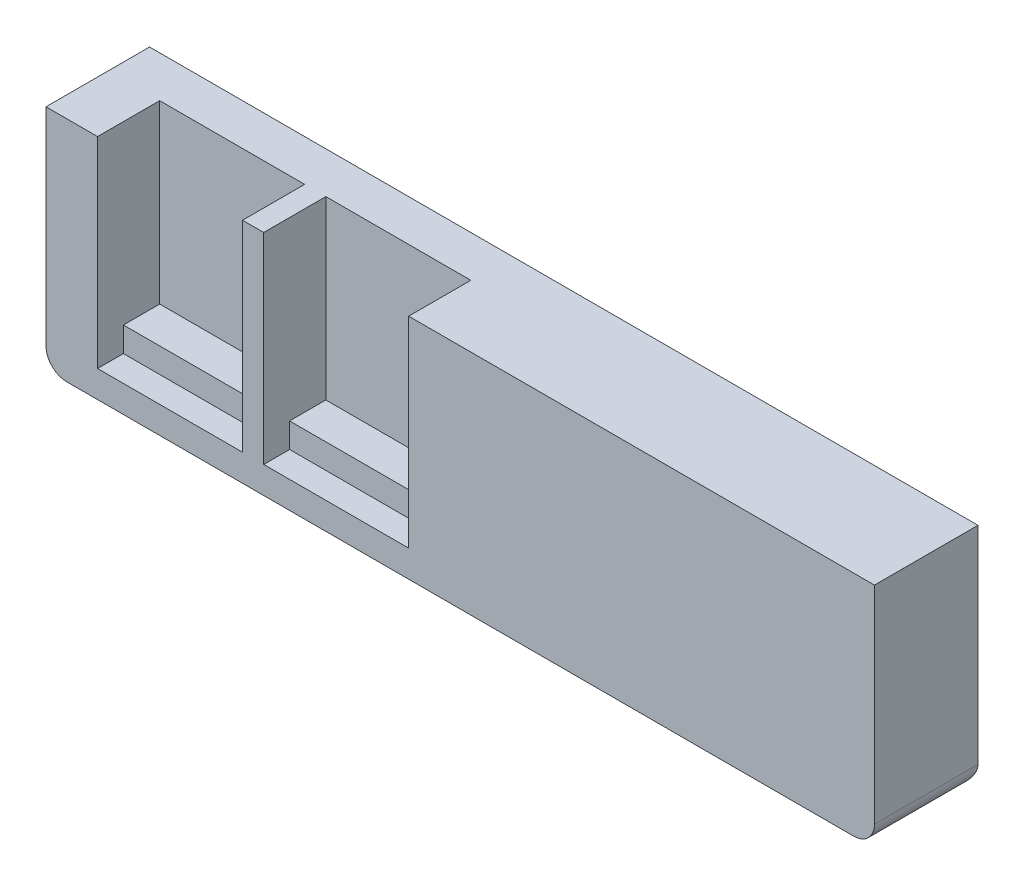
ISO-10303-21;
HEADER;
FILE_DESCRIPTION(('STEP AP214'),'2;1');
FILE_NAME('part.step','',(''),(''),'','','');
FILE_SCHEMA(('AUTOMOTIVE_DESIGN { 1 0 10303 214 1 1 1 1 }'));
ENDSEC;
DATA;
#1=APPLICATION_CONTEXT('core data for automotive mechanical design processes');
#2=APPLICATION_PROTOCOL_DEFINITION('international standard','automotive_design',2000,#1);
#3=PRODUCT_CONTEXT('',#1,'mechanical');
#4=PRODUCT('Part','Part','',(#3));
#5=PRODUCT_RELATED_PRODUCT_CATEGORY('part','',(#4));
#6=PRODUCT_DEFINITION_FORMATION('','',#4);
#7=PRODUCT_DEFINITION_CONTEXT('part definition',#1,'design');
#8=PRODUCT_DEFINITION('design','',#6,#7);
#9=PRODUCT_DEFINITION_SHAPE('','',#8);
#10=(LENGTH_UNIT() NAMED_UNIT(*) SI_UNIT(.MILLI.,.METRE.));
#11=(NAMED_UNIT(*) PLANE_ANGLE_UNIT() SI_UNIT($,.RADIAN.));
#12=(NAMED_UNIT(*) SI_UNIT($,.STERADIAN.) SOLID_ANGLE_UNIT());
#13=UNCERTAINTY_MEASURE_WITH_UNIT(LENGTH_MEASURE(1.E-05),#10,'distance_accuracy_value','');
#14=(GEOMETRIC_REPRESENTATION_CONTEXT(3) GLOBAL_UNCERTAINTY_ASSIGNED_CONTEXT((#13)) GLOBAL_UNIT_ASSIGNED_CONTEXT((#10,
#11,#12)) REPRESENTATION_CONTEXT('',''));
#15=CARTESIAN_POINT('',(0.,0.,0.));
#16=DIRECTION('',(0.,0.,1.));
#17=DIRECTION('',(1.,0.,0.));
#18=AXIS2_PLACEMENT_3D('',#15,#16,#17);
#19=CARTESIAN_POINT('',(0.,0.,-12.7));
#20=DIRECTION('',(0.,0.,1.));
#21=DIRECTION('',(1.,0.,0.));
#22=AXIS2_PLACEMENT_3D('',#19,#20,#21);
#23=PLANE('',#22);
#24=DIRECTION('',(-1.,0.,0.));
#25=VECTOR('',#24,1.);
#26=CARTESIAN_POINT('',(0.,3.302,-12.7));
#27=LINE('',#26,#25);
#28=CARTESIAN_POINT('',(24.1011996551631,3.302,-12.7));
#29=VERTEX_POINT('',#28);
#30=CARTESIAN_POINT('',(6.32119965516305,3.302,-12.7));
#31=VERTEX_POINT('',#30);
#32=EDGE_CURVE('E189',#29,#31,#27,.T.);
#33=ORIENTED_EDGE('',*,*,#32,.T.);
#34=DIRECTION('',(0.,1.,0.));
#35=VECTOR('',#34,1.);
#36=CARTESIAN_POINT('',(6.32119965516305,6.3388444270934,-12.7));
#37=LINE('',#36,#35);
#38=CARTESIAN_POINT('',(6.32119965516305,27.94,-12.7));
#39=VERTEX_POINT('',#38);
#40=EDGE_CURVE('E281',#31,#39,#37,.T.);
#41=ORIENTED_EDGE('',*,*,#40,.T.);
#42=DIRECTION('',(-1.,0.,0.));
#43=VECTOR('',#42,1.);
#44=CARTESIAN_POINT('',(0.,27.94,-12.7));
#45=LINE('',#44,#43);
#46=CARTESIAN_POINT('',(0.,27.94,-12.7));
#47=VERTEX_POINT('',#46);
#48=EDGE_CURVE('E43',#39,#47,#45,.T.);
#49=ORIENTED_EDGE('',*,*,#48,.T.);
#50=DIRECTION('',(0.,-1.,0.));
#51=VECTOR('',#50,1.);
#52=CARTESIAN_POINT('',(0.,50.8,-12.7));
#53=LINE('',#52,#51);
#54=CARTESIAN_POINT('',(0.,2.54,-12.7));
#55=VERTEX_POINT('',#54);
#56=EDGE_CURVE('E308',#47,#55,#53,.T.);
#57=ORIENTED_EDGE('',*,*,#56,.T.);
#58=CARTESIAN_POINT('',(2.54,2.54,-12.7));
#59=DIRECTION('',(0.,0.,1.));
#60=DIRECTION('',(1.,0.,0.));
#61=AXIS2_PLACEMENT_3D('',#58,#59,#60);
#62=CIRCLE('',#61,2.54);
#63=CARTESIAN_POINT('',(2.54,0.,-12.7));
#64=VERTEX_POINT('',#63);
#65=EDGE_CURVE('E211',#64,#55,#62,.F.);
#66=ORIENTED_EDGE('',*,*,#65,.F.);
#67=DIRECTION('',(-1.,0.,0.));
#68=VECTOR('',#67,1.);
#69=CARTESIAN_POINT('',(0.,0.,-12.7));
#70=LINE('',#69,#68);
#71=CARTESIAN_POINT('',(99.06,0.,-12.7));
#72=VERTEX_POINT('',#71);
#73=EDGE_CURVE('E311',#72,#64,#70,.T.);
#74=ORIENTED_EDGE('',*,*,#73,.F.);
#75=CARTESIAN_POINT('',(99.06,2.54,-12.7));
#76=DIRECTION('',(0.,0.,1.));
#77=DIRECTION('',(1.,0.,0.));
#78=AXIS2_PLACEMENT_3D('',#75,#76,#77);
#79=CIRCLE('',#78,2.54);
#80=CARTESIAN_POINT('',(101.6,2.54,-12.7));
#81=VERTEX_POINT('',#80);
#82=EDGE_CURVE('E318',#81,#72,#79,.F.);
#83=ORIENTED_EDGE('',*,*,#82,.F.);
#84=DIRECTION('',(0.,1.,0.));
#85=VECTOR('',#84,1.);
#86=CARTESIAN_POINT('',(101.6,50.8,-12.7));
#87=LINE('',#86,#85);
#88=CARTESIAN_POINT('',(101.6,27.94,-12.7));
#89=VERTEX_POINT('',#88);
#90=EDGE_CURVE('E303',#81,#89,#87,.T.);
#91=ORIENTED_EDGE('',*,*,#90,.T.);
#92=CARTESIAN_POINT('',(44.478800344837,27.94,-12.7));
#93=VERTEX_POINT('',#92);
#94=EDGE_CURVE('E200',#89,#93,#45,.T.);
#95=ORIENTED_EDGE('',*,*,#94,.T.);
#96=DIRECTION('',(0.,-1.,0.));
#97=VECTOR('',#96,1.);
#98=CARTESIAN_POINT('',(44.478800344837,6.3388444270934,-12.7));
#99=LINE('',#98,#97);
#100=CARTESIAN_POINT('',(44.4788003448369,3.302,-12.7));
#101=VERTEX_POINT('',#100);
#102=EDGE_CURVE('E290',#93,#101,#99,.T.);
#103=ORIENTED_EDGE('',*,*,#102,.T.);
#104=DIRECTION('',(1.,0.,0.));
#105=VECTOR('',#104,1.);
#106=CARTESIAN_POINT('',(0.,3.302,-12.7));
#107=LINE('',#106,#105);
#108=CARTESIAN_POINT('',(26.698800344837,3.302,-12.7));
#109=VERTEX_POINT('',#108);
#110=EDGE_CURVE('E314',#109,#101,#107,.T.);
#111=ORIENTED_EDGE('',*,*,#110,.F.);
#112=DIRECTION('',(0.,1.,0.));
#113=VECTOR('',#112,1.);
#114=CARTESIAN_POINT('',(26.698800344837,6.33884442709341,-12.7));
#115=LINE('',#114,#113);
#116=CARTESIAN_POINT('',(26.698800344837,27.94,-12.7));
#117=VERTEX_POINT('',#116);
#118=EDGE_CURVE('E294',#109,#117,#115,.T.);
#119=ORIENTED_EDGE('',*,*,#118,.T.);
#120=CARTESIAN_POINT('',(24.1011996551631,27.94,-12.7));
#121=VERTEX_POINT('',#120);
#122=EDGE_CURVE('E192',#117,#121,#45,.T.);
#123=ORIENTED_EDGE('',*,*,#122,.T.);
#124=DIRECTION('',(0.,-1.,0.));
#125=VECTOR('',#124,1.);
#126=CARTESIAN_POINT('',(24.1011996551631,6.33884442709341,-12.7));
#127=LINE('',#126,#125);
#128=EDGE_CURVE('E175',#121,#29,#127,.T.);
#129=ORIENTED_EDGE('',*,*,#128,.T.);
#130=EDGE_LOOP('',(#33,#41,#49,#57,#66,#74,#83,#91,#95,#103,#111,#119,#123,#129));
#131=FACE_BOUND('',#130,.T.);
#132=ADVANCED_FACE('F39',(#131),#23,.T.);
#133=CARTESIAN_POINT('',(0.,27.94,0.));
#134=DIRECTION('',(0.,1.,0.));
#135=DIRECTION('',(0.,0.,1.));
#136=AXIS2_PLACEMENT_3D('',#133,#134,#135);
#137=PLANE('',#136);
#138=DIRECTION('',(-1.,0.,0.));
#139=VECTOR('',#138,1.);
#140=CARTESIAN_POINT('',(0.,27.94,-25.4));
#141=LINE('',#140,#139);
#142=CARTESIAN_POINT('',(101.6,27.94,-25.4));
#143=VERTEX_POINT('',#142);
#144=CARTESIAN_POINT('',(0.,27.94,-25.4));
#145=VERTEX_POINT('',#144);
#146=EDGE_CURVE('E299',#143,#145,#141,.T.);
#147=ORIENTED_EDGE('',*,*,#146,.T.);
#148=DIRECTION('',(0.,0.,1.));
#149=VECTOR('',#148,1.);
#150=CARTESIAN_POINT('',(0.,27.94,0.));
#151=LINE('',#150,#149);
#152=EDGE_CURVE('E309',#145,#47,#151,.T.);
#153=ORIENTED_EDGE('',*,*,#152,.T.);
#154=ORIENTED_EDGE('',*,*,#48,.F.);
#155=DIRECTION('',(0.,0.,-1.));
#156=VECTOR('',#155,1.);
#157=CARTESIAN_POINT('',(6.32119965516305,27.94,-20.32));
#158=LINE('',#157,#156);
#159=CARTESIAN_POINT('',(6.32119965516305,27.94,-20.32));
#160=VERTEX_POINT('',#159);
#161=EDGE_CURVE('E282',#39,#160,#158,.T.);
#162=ORIENTED_EDGE('',*,*,#161,.T.);
#163=DIRECTION('',(-1.,0.,0.));
#164=VECTOR('',#163,1.);
#165=CARTESIAN_POINT('',(0.,27.94,-20.32));
#166=LINE('',#165,#164);
#167=CARTESIAN_POINT('',(24.1011996551631,27.94,-20.32));
#168=VERTEX_POINT('',#167);
#169=EDGE_CURVE('E312',#168,#160,#166,.T.);
#170=ORIENTED_EDGE('',*,*,#169,.F.);
#171=DIRECTION('',(0.,0.,1.));
#172=VECTOR('',#171,1.);
#173=CARTESIAN_POINT('',(24.1011996551631,27.94,-20.32));
#174=LINE('',#173,#172);
#175=EDGE_CURVE('E194',#168,#121,#174,.T.);
#176=ORIENTED_EDGE('',*,*,#175,.T.);
#177=ORIENTED_EDGE('',*,*,#122,.F.);
#178=DIRECTION('',(0.,0.,-1.));
#179=VECTOR('',#178,1.);
#180=CARTESIAN_POINT('',(26.698800344837,27.94,-20.32));
#181=LINE('',#180,#179);
#182=CARTESIAN_POINT('',(26.698800344837,27.94,-20.32));
#183=VERTEX_POINT('',#182);
#184=EDGE_CURVE('E295',#117,#183,#181,.T.);
#185=ORIENTED_EDGE('',*,*,#184,.T.);
#186=DIRECTION('',(1.,0.,0.));
#187=VECTOR('',#186,1.);
#188=CARTESIAN_POINT('',(0.,27.94,-20.32));
#189=LINE('',#188,#187);
#190=CARTESIAN_POINT('',(44.478800344837,27.94,-20.32));
#191=VERTEX_POINT('',#190);
#192=EDGE_CURVE('E286',#183,#191,#189,.T.);
#193=ORIENTED_EDGE('',*,*,#192,.T.);
#194=DIRECTION('',(0.,0.,1.));
#195=VECTOR('',#194,1.);
#196=CARTESIAN_POINT('',(44.478800344837,27.94,-20.32));
#197=LINE('',#196,#195);
#198=EDGE_CURVE('E291',#191,#93,#197,.T.);
#199=ORIENTED_EDGE('',*,*,#198,.T.);
#200=ORIENTED_EDGE('',*,*,#94,.F.);
#201=DIRECTION('',(0.,0.,-1.));
#202=VECTOR('',#201,1.);
#203=CARTESIAN_POINT('',(101.6,27.94,0.));
#204=LINE('',#203,#202);
#205=EDGE_CURVE('E304',#89,#143,#204,.T.);
#206=ORIENTED_EDGE('',*,*,#205,.T.);
#207=EDGE_LOOP('',(#147,#153,#154,#162,#170,#176,#177,#185,#193,#199,#200,#206));
#208=FACE_BOUND('',#207,.T.);
#209=ADVANCED_FACE('F342',(#208),#137,.T.);
#210=CARTESIAN_POINT('',(0.,2.54,-22.86));
#211=DIRECTION('',(1.,0.,0.));
#212=DIRECTION('',(0.,0.,-1.));
#213=AXIS2_PLACEMENT_3D('',#210,#211,#212);
#214=CYLINDRICAL_SURFACE('',#213,2.54);
#215=CARTESIAN_POINT('',(99.06,2.54,-22.86));
#216=DIRECTION('',(0.707106781186548,0.,0.707106781186547));
#217=DIRECTION('',(-0.707106781186547,0.,0.707106781186548));
#218=AXIS2_PLACEMENT_3D('',#215,#216,#217);
#219=ELLIPSE('',#218,3.59210244842766,2.54);
#220=CARTESIAN_POINT('',(101.6,2.54,-25.4));
#221=VERTEX_POINT('',#220);
#222=CARTESIAN_POINT('',(99.06,0.,-22.86));
#223=VERTEX_POINT('',#222);
#224=EDGE_CURVE('E50',#221,#223,#219,.F.);
#225=ORIENTED_EDGE('',*,*,#224,.T.);
#226=DIRECTION('',(-1.,0.,0.));
#227=VECTOR('',#226,1.);
#228=CARTESIAN_POINT('',(101.6,0.,-22.86));
#229=LINE('',#228,#227);
#230=CARTESIAN_POINT('',(2.54,0.,-22.86));
#231=VERTEX_POINT('',#230);
#232=EDGE_CURVE('E215',#231,#223,#229,.F.);
#233=ORIENTED_EDGE('',*,*,#232,.F.);
#234=CARTESIAN_POINT('',(2.54,2.54,-22.86));
#235=DIRECTION('',(0.707106781186547,0.,-0.707106781186547));
#236=DIRECTION('',(-0.707106781186547,0.,-0.707106781186547));
#237=AXIS2_PLACEMENT_3D('',#234,#235,#236);
#238=ELLIPSE('',#237,3.59210244842766,2.54);
#239=CARTESIAN_POINT('',(0.,2.54,-25.4));
#240=VERTEX_POINT('',#239);
#241=EDGE_CURVE('E11',#231,#240,#238,.T.);
#242=ORIENTED_EDGE('',*,*,#241,.T.);
#243=DIRECTION('',(-1.,0.,0.));
#244=VECTOR('',#243,1.);
#245=CARTESIAN_POINT('',(0.,2.54,-25.4));
#246=LINE('',#245,#244);
#247=EDGE_CURVE('E223',#221,#240,#246,.T.);
#248=ORIENTED_EDGE('',*,*,#247,.F.);
#249=EDGE_LOOP('',(#225,#233,#242,#248));
#250=FACE_BOUND('',#249,.T.);
#251=ADVANCED_FACE('F385',(#250),#214,.T.);
#252=CARTESIAN_POINT('',(0.,50.8,0.));
#253=DIRECTION('',(1.,0.,0.));
#254=DIRECTION('',(0.,0.,-1.));
#255=AXIS2_PLACEMENT_3D('',#252,#253,#254);
#256=PLANE('',#255);
#257=ORIENTED_EDGE('',*,*,#152,.F.);
#258=DIRECTION('',(0.,-1.,0.));
#259=VECTOR('',#258,1.);
#260=CARTESIAN_POINT('',(0.,50.8,-25.4));
#261=LINE('',#260,#259);
#262=EDGE_CURVE('E228',#145,#240,#261,.T.);
#263=ORIENTED_EDGE('',*,*,#262,.T.);
#264=DIRECTION('',(0.,0.,1.));
#265=VECTOR('',#264,1.);
#266=CARTESIAN_POINT('',(0.,2.54,0.));
#267=LINE('',#266,#265);
#268=EDGE_CURVE('E206',#240,#55,#267,.T.);
#269=ORIENTED_EDGE('',*,*,#268,.T.);
#270=ORIENTED_EDGE('',*,*,#56,.F.);
#271=EDGE_LOOP('',(#257,#263,#269,#270));
#272=FACE_BOUND('',#271,.T.);
#273=ADVANCED_FACE('F350',(#272),#256,.F.);
#274=CARTESIAN_POINT('',(0.,0.,0.));
#275=DIRECTION('',(0.,-1.,0.));
#276=DIRECTION('',(0.,0.,-1.));
#277=AXIS2_PLACEMENT_3D('',#274,#275,#276);
#278=PLANE('',#277);
#279=DIRECTION('',(0.,0.,-1.));
#280=VECTOR('',#279,1.);
#281=CARTESIAN_POINT('',(99.06,0.,0.));
#282=LINE('',#281,#280);
#283=EDGE_CURVE('E216',#223,#72,#282,.F.);
#284=ORIENTED_EDGE('',*,*,#283,.T.);
#285=ORIENTED_EDGE('',*,*,#73,.T.);
#286=DIRECTION('',(0.,0.,1.));
#287=VECTOR('',#286,1.);
#288=CARTESIAN_POINT('',(2.54,0.,-25.4));
#289=LINE('',#288,#287);
#290=EDGE_CURVE('E220',#64,#231,#289,.F.);
#291=ORIENTED_EDGE('',*,*,#290,.T.);
#292=ORIENTED_EDGE('',*,*,#232,.T.);
#293=EDGE_LOOP('',(#284,#285,#291,#292));
#294=FACE_BOUND('',#293,.T.);
#295=ADVANCED_FACE('F390',(#294),#278,.T.);
#296=CARTESIAN_POINT('',(2.54,2.54,0.));
#297=DIRECTION('',(0.,0.,-1.));
#298=DIRECTION('',(-1.,0.,0.));
#299=AXIS2_PLACEMENT_3D('',#296,#297,#298);
#300=CYLINDRICAL_SURFACE('',#299,2.54);
#301=ORIENTED_EDGE('',*,*,#290,.F.);
#302=ORIENTED_EDGE('',*,*,#65,.T.);
#303=ORIENTED_EDGE('',*,*,#268,.F.);
#304=ORIENTED_EDGE('',*,*,#241,.F.);
#305=EDGE_LOOP('',(#301,#302,#303,#304));
#306=FACE_BOUND('',#305,.T.);
#307=ADVANCED_FACE('F391',(#306),#300,.T.);
#308=CARTESIAN_POINT('',(101.6,50.8,0.));
#309=DIRECTION('',(-1.,0.,0.));
#310=DIRECTION('',(0.,0.,1.));
#311=AXIS2_PLACEMENT_3D('',#308,#309,#310);
#312=PLANE('',#311);
#313=ORIENTED_EDGE('',*,*,#205,.F.);
#314=ORIENTED_EDGE('',*,*,#90,.F.);
#315=DIRECTION('',(0.,0.,-1.));
#316=VECTOR('',#315,1.);
#317=CARTESIAN_POINT('',(101.6,2.54,-25.4));
#318=LINE('',#317,#316);
#319=EDGE_CURVE('E210',#81,#221,#318,.T.);
#320=ORIENTED_EDGE('',*,*,#319,.T.);
#321=DIRECTION('',(0.,-1.,0.));
#322=VECTOR('',#321,1.);
#323=CARTESIAN_POINT('',(101.6,50.8,-25.4));
#324=LINE('',#323,#322);
#325=EDGE_CURVE('E276',#143,#221,#324,.T.);
#326=ORIENTED_EDGE('',*,*,#325,.F.);
#327=EDGE_LOOP('',(#313,#314,#320,#326));
#328=FACE_BOUND('',#327,.T.);
#329=ADVANCED_FACE('F396',(#328),#312,.F.);
#330=CARTESIAN_POINT('',(99.06,2.54,0.));
#331=DIRECTION('',(0.,0.,1.));
#332=DIRECTION('',(1.,0.,0.));
#333=AXIS2_PLACEMENT_3D('',#330,#331,#332);
#334=CYLINDRICAL_SURFACE('',#333,2.54);
#335=ORIENTED_EDGE('',*,*,#319,.F.);
#336=ORIENTED_EDGE('',*,*,#82,.T.);
#337=ORIENTED_EDGE('',*,*,#283,.F.);
#338=ORIENTED_EDGE('',*,*,#224,.F.);
#339=EDGE_LOOP('',(#335,#336,#337,#338));
#340=FACE_BOUND('',#339,.T.);
#341=ADVANCED_FACE('F389',(#340),#334,.T.);
#342=CARTESIAN_POINT('',(0.,50.8,-25.4));
#343=DIRECTION('',(0.,0.,1.));
#344=DIRECTION('',(1.,0.,0.));
#345=AXIS2_PLACEMENT_3D('',#342,#343,#344);
#346=PLANE('',#345);
#347=ORIENTED_EDGE('',*,*,#146,.F.);
#348=ORIENTED_EDGE('',*,*,#325,.T.);
#349=ORIENTED_EDGE('',*,*,#247,.T.);
#350=ORIENTED_EDGE('',*,*,#262,.F.);
#351=EDGE_LOOP('',(#347,#348,#349,#350));
#352=FACE_BOUND('',#351,.T.);
#353=ADVANCED_FACE('F393',(#352),#346,.F.);
#354=CARTESIAN_POINT('',(26.698800344837,6.33884442709341,-20.32));
#355=DIRECTION('',(0.,-1.,0.));
#356=DIRECTION('',(1.,0.,0.));
#357=AXIS2_PLACEMENT_3D('',#354,#355,#356);
#358=PLANE('',#357);
#359=DIRECTION('',(0.,0.,1.));
#360=VECTOR('',#359,1.);
#361=CARTESIAN_POINT('',(26.698800344837,6.33884442709341,-20.32));
#362=LINE('',#361,#360);
#363=CARTESIAN_POINT('',(26.698800344837,6.33884442709341,-20.32));
#364=VERTEX_POINT('',#363);
#365=CARTESIAN_POINT('',(26.698800344837,6.33884442709341,-15.875));
#366=VERTEX_POINT('',#365);
#367=EDGE_CURVE('E237',#364,#366,#362,.T.);
#368=ORIENTED_EDGE('',*,*,#367,.T.);
#369=DIRECTION('',(1.,0.,0.));
#370=VECTOR('',#369,1.);
#371=CARTESIAN_POINT('',(26.698800344837,6.33884442709341,-15.875));
#372=LINE('',#371,#370);
#373=CARTESIAN_POINT('',(44.478800344837,6.3388444270934,-15.875));
#374=VERTEX_POINT('',#373);
#375=EDGE_CURVE('E369',#366,#374,#372,.T.);
#376=ORIENTED_EDGE('',*,*,#375,.T.);
#377=DIRECTION('',(0.,0.,1.));
#378=VECTOR('',#377,1.);
#379=CARTESIAN_POINT('',(44.478800344837,6.3388444270934,-20.32));
#380=LINE('',#379,#378);
#381=CARTESIAN_POINT('',(44.478800344837,6.3388444270934,-20.32));
#382=VERTEX_POINT('',#381);
#383=EDGE_CURVE('E233',#382,#374,#380,.T.);
#384=ORIENTED_EDGE('',*,*,#383,.F.);
#385=DIRECTION('',(1.,0.,0.));
#386=VECTOR('',#385,1.);
#387=CARTESIAN_POINT('',(26.698800344837,6.33884442709341,-20.32));
#388=LINE('',#387,#386);
#389=EDGE_CURVE('E265',#364,#382,#388,.T.);
#390=ORIENTED_EDGE('',*,*,#389,.F.);
#391=EDGE_LOOP('',(#368,#376,#384,#390));
#392=FACE_BOUND('',#391,.T.);
#393=ADVANCED_FACE('F414',(#392),#358,.F.);
#394=CARTESIAN_POINT('',(44.4788003448369,3.302,-15.875));
#395=DIRECTION('',(0.,0.,-1.));
#396=DIRECTION('',(-1.,0.,0.));
#397=AXIS2_PLACEMENT_3D('',#394,#395,#396);
#398=PLANE('',#397);
#399=DIRECTION('',(0.,1.,0.));
#400=VECTOR('',#399,1.);
#401=CARTESIAN_POINT('',(26.698800344837,3.302,-15.875));
#402=LINE('',#401,#400);
#403=CARTESIAN_POINT('',(26.698800344837,3.302,-15.875));
#404=VERTEX_POINT('',#403);
#405=EDGE_CURVE('E183',#404,#366,#402,.T.);
#406=ORIENTED_EDGE('',*,*,#405,.F.);
#407=DIRECTION('',(-1.,0.,0.));
#408=VECTOR('',#407,1.);
#409=CARTESIAN_POINT('',(44.4788003448369,3.302,-15.875));
#410=LINE('',#409,#408);
#411=CARTESIAN_POINT('',(44.4788003448369,3.302,-15.875));
#412=VERTEX_POINT('',#411);
#413=EDGE_CURVE('E249',#412,#404,#410,.T.);
#414=ORIENTED_EDGE('',*,*,#413,.F.);
#415=DIRECTION('',(0.,1.,0.));
#416=VECTOR('',#415,1.);
#417=CARTESIAN_POINT('',(44.4788003448369,3.302,-15.875));
#418=LINE('',#417,#416);
#419=EDGE_CURVE('E250',#412,#374,#418,.T.);
#420=ORIENTED_EDGE('',*,*,#419,.T.);
#421=ORIENTED_EDGE('',*,*,#375,.F.);
#422=EDGE_LOOP('',(#406,#414,#420,#421));
#423=FACE_BOUND('',#422,.T.);
#424=ADVANCED_FACE('F410',(#423),#398,.F.);
#425=CARTESIAN_POINT('',(44.478800344837,6.3388444270934,-20.32));
#426=DIRECTION('',(1.,0.,0.));
#427=DIRECTION('',(0.,1.,0.));
#428=AXIS2_PLACEMENT_3D('',#425,#426,#427);
#429=PLANE('',#428);
#430=ORIENTED_EDGE('',*,*,#198,.F.);
#431=DIRECTION('',(0.,1.,0.));
#432=VECTOR('',#431,1.);
#433=CARTESIAN_POINT('',(44.478800344837,6.3388444270934,-20.32));
#434=LINE('',#433,#432);
#435=EDGE_CURVE('E242',#382,#191,#434,.T.);
#436=ORIENTED_EDGE('',*,*,#435,.F.);
#437=ORIENTED_EDGE('',*,*,#383,.T.);
#438=ORIENTED_EDGE('',*,*,#419,.F.);
#439=DIRECTION('',(0.,0.,-1.));
#440=VECTOR('',#439,1.);
#441=CARTESIAN_POINT('',(44.4788003448369,3.302,-9.52500000000001));
#442=LINE('',#441,#440);
#443=EDGE_CURVE('E59',#101,#412,#442,.T.);
#444=ORIENTED_EDGE('',*,*,#443,.F.);
#445=ORIENTED_EDGE('',*,*,#102,.F.);
#446=EDGE_LOOP('',(#430,#436,#437,#438,#444,#445));
#447=FACE_BOUND('',#446,.T.);
#448=ADVANCED_FACE('F403',(#447),#429,.F.);
#449=CARTESIAN_POINT('',(26.698800344837,6.33884442709341,-20.32));
#450=DIRECTION('',(-1.,0.,0.));
#451=DIRECTION('',(0.,0.,1.));
#452=AXIS2_PLACEMENT_3D('',#449,#450,#451);
#453=PLANE('',#452);
#454=ORIENTED_EDGE('',*,*,#184,.F.);
#455=ORIENTED_EDGE('',*,*,#118,.F.);
#456=DIRECTION('',(0.,0.,1.));
#457=VECTOR('',#456,1.);
#458=CARTESIAN_POINT('',(26.698800344837,3.302,-9.525));
#459=LINE('',#458,#457);
#460=EDGE_CURVE('E245',#404,#109,#459,.T.);
#461=ORIENTED_EDGE('',*,*,#460,.F.);
#462=ORIENTED_EDGE('',*,*,#405,.T.);
#463=ORIENTED_EDGE('',*,*,#367,.F.);
#464=DIRECTION('',(0.,-1.,0.));
#465=VECTOR('',#464,1.);
#466=CARTESIAN_POINT('',(26.698800344837,6.33884442709341,-20.32));
#467=LINE('',#466,#465);
#468=EDGE_CURVE('E262',#183,#364,#467,.T.);
#469=ORIENTED_EDGE('',*,*,#468,.F.);
#470=EDGE_LOOP('',(#454,#455,#461,#462,#463,#469));
#471=FACE_BOUND('',#470,.T.);
#472=ADVANCED_FACE('F41',(#471),#453,.F.);
#473=CARTESIAN_POINT('',(0.,3.302,0.));
#474=DIRECTION('',(0.,1.,0.));
#475=DIRECTION('',(0.,0.,1.));
#476=AXIS2_PLACEMENT_3D('',#473,#474,#475);
#477=PLANE('',#476);
#478=ORIENTED_EDGE('',*,*,#460,.T.);
#479=ORIENTED_EDGE('',*,*,#110,.T.);
#480=ORIENTED_EDGE('',*,*,#443,.T.);
#481=ORIENTED_EDGE('',*,*,#413,.T.);
#482=EDGE_LOOP('',(#478,#479,#480,#481));
#483=FACE_BOUND('',#482,.T.);
#484=ADVANCED_FACE('F407',(#483),#477,.T.);
#485=CARTESIAN_POINT('',(0.,0.,-20.32));
#486=DIRECTION('',(0.,0.,-1.));
#487=DIRECTION('',(-1.,0.,0.));
#488=AXIS2_PLACEMENT_3D('',#485,#486,#487);
#489=PLANE('',#488);
#490=ORIENTED_EDGE('',*,*,#192,.F.);
#491=ORIENTED_EDGE('',*,*,#468,.T.);
#492=ORIENTED_EDGE('',*,*,#389,.T.);
#493=ORIENTED_EDGE('',*,*,#435,.T.);
#494=EDGE_LOOP('',(#490,#491,#492,#493));
#495=FACE_BOUND('',#494,.T.);
#496=ADVANCED_FACE('F416',(#495),#489,.F.);
#497=CARTESIAN_POINT('',(6.32119965516305,6.3388444270934,-20.32));
#498=DIRECTION('',(-1.,0.,0.));
#499=DIRECTION('',(0.,-1.,0.));
#500=AXIS2_PLACEMENT_3D('',#497,#498,#499);
#501=PLANE('',#500);
#502=ORIENTED_EDGE('',*,*,#161,.F.);
#503=ORIENTED_EDGE('',*,*,#40,.F.);
#504=DIRECTION('',(0.,0.,1.));
#505=VECTOR('',#504,1.);
#506=CARTESIAN_POINT('',(6.32119965516305,3.302,-9.525));
#507=LINE('',#506,#505);
#508=CARTESIAN_POINT('',(6.32119965516305,3.302,-15.875));
#509=VERTEX_POINT('',#508);
#510=EDGE_CURVE('E197',#509,#31,#507,.T.);
#511=ORIENTED_EDGE('',*,*,#510,.F.);
#512=DIRECTION('',(0.,1.,0.));
#513=VECTOR('',#512,1.);
#514=CARTESIAN_POINT('',(6.32119965516305,3.302,-15.875));
#515=LINE('',#514,#513);
#516=CARTESIAN_POINT('',(6.32119965516305,6.33884442709341,-15.875));
#517=VERTEX_POINT('',#516);
#518=EDGE_CURVE('E71',#509,#517,#515,.T.);
#519=ORIENTED_EDGE('',*,*,#518,.T.);
#520=DIRECTION('',(0.,0.,1.));
#521=VECTOR('',#520,1.);
#522=CARTESIAN_POINT('',(6.32119965516305,6.3388444270934,-20.32));
#523=LINE('',#522,#521);
#524=CARTESIAN_POINT('',(6.32119965516305,6.3388444270934,-20.32));
#525=VERTEX_POINT('',#524);
#526=EDGE_CURVE('E227',#525,#517,#523,.T.);
#527=ORIENTED_EDGE('',*,*,#526,.F.);
#528=DIRECTION('',(0.,-1.,0.));
#529=VECTOR('',#528,1.);
#530=CARTESIAN_POINT('',(6.32119965516305,6.3388444270934,-20.32));
#531=LINE('',#530,#529);
#532=EDGE_CURVE('E238',#160,#525,#531,.T.);
#533=ORIENTED_EDGE('',*,*,#532,.F.);
#534=EDGE_LOOP('',(#502,#503,#511,#519,#527,#533));
#535=FACE_BOUND('',#534,.T.);
#536=ADVANCED_FACE('F423',(#535),#501,.F.);
#537=CARTESIAN_POINT('',(24.1011996551631,6.33884442709341,-20.32));
#538=DIRECTION('',(1.,0.,0.));
#539=DIRECTION('',(0.,0.,-1.));
#540=AXIS2_PLACEMENT_3D('',#537,#538,#539);
#541=PLANE('',#540);
#542=ORIENTED_EDGE('',*,*,#175,.F.);
#543=DIRECTION('',(0.,1.,0.));
#544=VECTOR('',#543,1.);
#545=CARTESIAN_POINT('',(24.1011996551631,6.33884442709341,-20.32));
#546=LINE('',#545,#544);
#547=CARTESIAN_POINT('',(24.1011996551631,6.33884442709341,-20.32));
#548=VERTEX_POINT('',#547);
#549=EDGE_CURVE('E232',#548,#168,#546,.T.);
#550=ORIENTED_EDGE('',*,*,#549,.F.);
#551=DIRECTION('',(0.,0.,1.));
#552=VECTOR('',#551,1.);
#553=CARTESIAN_POINT('',(24.1011996551631,6.33884442709341,-20.32));
#554=LINE('',#553,#552);
#555=CARTESIAN_POINT('',(24.1011996551631,6.33884442709341,-15.875));
#556=VERTEX_POINT('',#555);
#557=EDGE_CURVE('E224',#548,#556,#554,.T.);
#558=ORIENTED_EDGE('',*,*,#557,.T.);
#559=DIRECTION('',(0.,1.,0.));
#560=VECTOR('',#559,1.);
#561=CARTESIAN_POINT('',(24.1011996551631,3.302,-15.875));
#562=LINE('',#561,#560);
#563=CARTESIAN_POINT('',(24.1011996551631,3.302,-15.875));
#564=VERTEX_POINT('',#563);
#565=EDGE_CURVE('E178',#564,#556,#562,.T.);
#566=ORIENTED_EDGE('',*,*,#565,.F.);
#567=DIRECTION('',(0.,0.,-1.));
#568=VECTOR('',#567,1.);
#569=CARTESIAN_POINT('',(24.1011996551631,3.302,-9.525));
#570=LINE('',#569,#568);
#571=EDGE_CURVE('E171',#29,#564,#570,.T.);
#572=ORIENTED_EDGE('',*,*,#571,.F.);
#573=ORIENTED_EDGE('',*,*,#128,.F.);
#574=EDGE_LOOP('',(#542,#550,#558,#566,#572,#573));
#575=FACE_BOUND('',#574,.T.);
#576=ADVANCED_FACE('F174',(#575),#541,.F.);
#577=CARTESIAN_POINT('',(0.,0.,-20.32));
#578=DIRECTION('',(0.,0.,1.));
#579=DIRECTION('',(1.,0.,0.));
#580=AXIS2_PLACEMENT_3D('',#577,#578,#579);
#581=PLANE('',#580);
#582=ORIENTED_EDGE('',*,*,#549,.T.);
#583=ORIENTED_EDGE('',*,*,#169,.T.);
#584=ORIENTED_EDGE('',*,*,#532,.T.);
#585=DIRECTION('',(1.,0.,0.));
#586=VECTOR('',#585,1.);
#587=CARTESIAN_POINT('',(24.1011996551631,6.33884442709341,-20.32));
#588=LINE('',#587,#586);
#589=EDGE_CURVE('E270',#525,#548,#588,.T.);
#590=ORIENTED_EDGE('',*,*,#589,.T.);
#591=EDGE_LOOP('',(#582,#583,#584,#590));
#592=FACE_BOUND('',#591,.T.);
#593=ADVANCED_FACE('F418',(#592),#581,.T.);
#594=CARTESIAN_POINT('',(0.,3.302,0.));
#595=DIRECTION('',(0.,-1.,0.));
#596=DIRECTION('',(0.,0.,-1.));
#597=AXIS2_PLACEMENT_3D('',#594,#595,#596);
#598=PLANE('',#597);
#599=ORIENTED_EDGE('',*,*,#32,.F.);
#600=ORIENTED_EDGE('',*,*,#571,.T.);
#601=DIRECTION('',(-1.,0.,0.));
#602=VECTOR('',#601,1.);
#603=CARTESIAN_POINT('',(6.32119965516305,3.302,-15.875));
#604=LINE('',#603,#602);
#605=EDGE_CURVE('E184',#564,#509,#604,.T.);
#606=ORIENTED_EDGE('',*,*,#605,.T.);
#607=ORIENTED_EDGE('',*,*,#510,.T.);
#608=EDGE_LOOP('',(#599,#600,#606,#607));
#609=FACE_BOUND('',#608,.T.);
#610=ADVANCED_FACE('F196',(#609),#598,.F.);
#611=CARTESIAN_POINT('',(24.1011996551631,6.33884442709341,-20.32));
#612=DIRECTION('',(0.,-1.,0.));
#613=DIRECTION('',(1.,0.,0.));
#614=AXIS2_PLACEMENT_3D('',#611,#612,#613);
#615=PLANE('',#614);
#616=ORIENTED_EDGE('',*,*,#526,.T.);
#617=DIRECTION('',(1.,0.,0.));
#618=VECTOR('',#617,1.);
#619=CARTESIAN_POINT('',(24.1011996551631,6.33884442709341,-15.875));
#620=LINE('',#619,#618);
#621=EDGE_CURVE('E77',#517,#556,#620,.T.);
#622=ORIENTED_EDGE('',*,*,#621,.T.);
#623=ORIENTED_EDGE('',*,*,#557,.F.);
#624=ORIENTED_EDGE('',*,*,#589,.F.);
#625=EDGE_LOOP('',(#616,#622,#623,#624));
#626=FACE_BOUND('',#625,.T.);
#627=ADVANCED_FACE('F422',(#626),#615,.F.);
#628=CARTESIAN_POINT('',(6.32119965516305,3.302,-15.875));
#629=DIRECTION('',(0.,0.,-1.));
#630=DIRECTION('',(-1.,0.,0.));
#631=AXIS2_PLACEMENT_3D('',#628,#629,#630);
#632=PLANE('',#631);
#633=ORIENTED_EDGE('',*,*,#518,.F.);
#634=ORIENTED_EDGE('',*,*,#605,.F.);
#635=ORIENTED_EDGE('',*,*,#565,.T.);
#636=ORIENTED_EDGE('',*,*,#621,.F.);
#637=EDGE_LOOP('',(#633,#634,#635,#636));
#638=FACE_BOUND('',#637,.T.);
#639=ADVANCED_FACE('F424',(#638),#632,.F.);
#640=CLOSED_SHELL('',(#132,#209,#251,#273,#295,#307,#329,#341,#353,#393,#424,#448,#472,#484,
#496,#536,#576,#593,#610,#627,#639));
#641=MANIFOLD_SOLID_BREP('B2',#640);
#642=ADVANCED_BREP_SHAPE_REPRESENTATION('',(#18,#641),#14);
#643=SHAPE_DEFINITION_REPRESENTATION(#9,#642);
ENDSEC;
END-ISO-10303-21;
